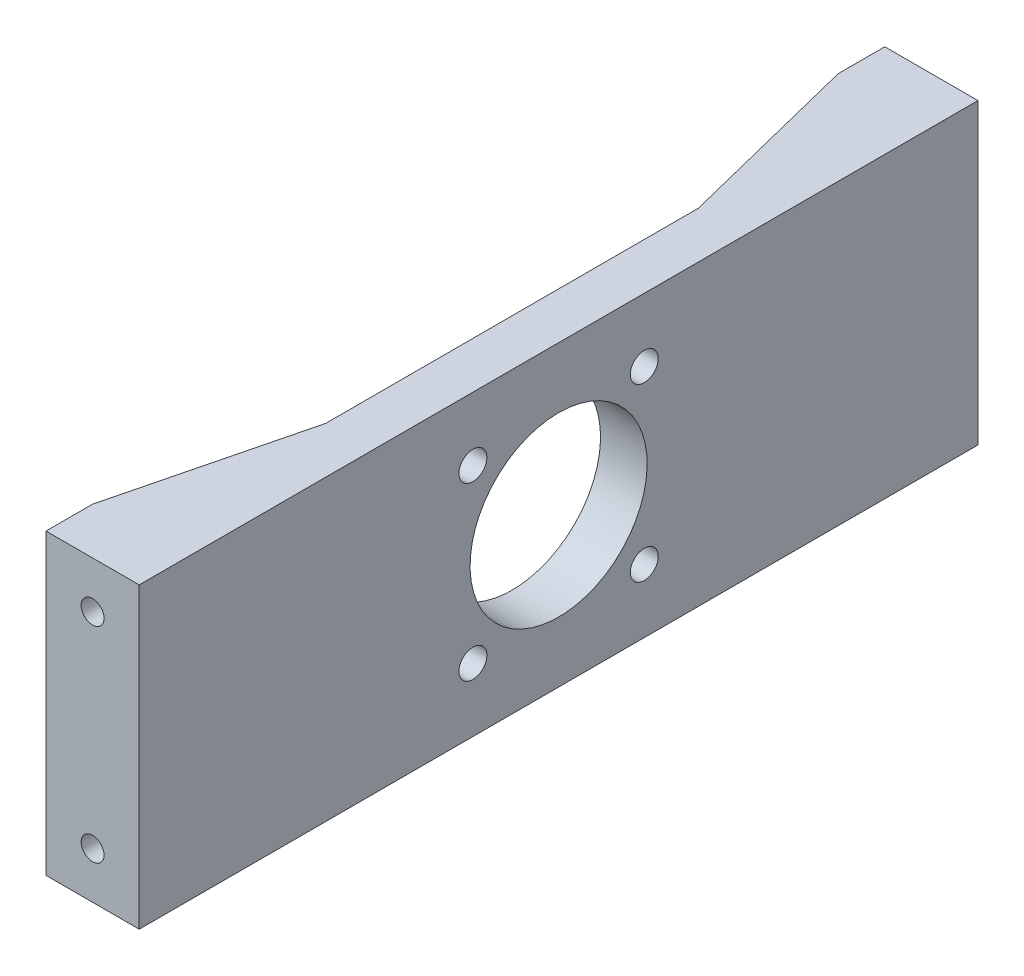
ISO-10303-21;
HEADER;
FILE_DESCRIPTION(('STEP AP214'),'2;1');
FILE_NAME('part.step','',(''),(''),'','','');
FILE_SCHEMA(('AUTOMOTIVE_DESIGN { 1 0 10303 214 1 1 1 1 }'));
ENDSEC;
DATA;
#1=APPLICATION_CONTEXT('core data for automotive mechanical design processes');
#2=APPLICATION_PROTOCOL_DEFINITION('international standard','automotive_design',2000,#1);
#3=PRODUCT_CONTEXT('',#1,'mechanical');
#4=PRODUCT('Part','Part','',(#3));
#5=PRODUCT_RELATED_PRODUCT_CATEGORY('part','',(#4));
#6=PRODUCT_DEFINITION_FORMATION('','',#4);
#7=PRODUCT_DEFINITION_CONTEXT('part definition',#1,'design');
#8=PRODUCT_DEFINITION('design','',#6,#7);
#9=PRODUCT_DEFINITION_SHAPE('','',#8);
#10=(LENGTH_UNIT() NAMED_UNIT(*) SI_UNIT(.MILLI.,.METRE.));
#11=(NAMED_UNIT(*) PLANE_ANGLE_UNIT() SI_UNIT($,.RADIAN.));
#12=(NAMED_UNIT(*) SI_UNIT($,.STERADIAN.) SOLID_ANGLE_UNIT());
#13=UNCERTAINTY_MEASURE_WITH_UNIT(LENGTH_MEASURE(1.E-05),#10,'distance_accuracy_value','');
#14=(GEOMETRIC_REPRESENTATION_CONTEXT(3) GLOBAL_UNCERTAINTY_ASSIGNED_CONTEXT((#13)) GLOBAL_UNIT_ASSIGNED_CONTEXT((#10,
#11,#12)) REPRESENTATION_CONTEXT('',''));
#15=CARTESIAN_POINT('',(0.,0.,0.));
#16=DIRECTION('',(0.,0.,1.));
#17=DIRECTION('',(1.,0.,0.));
#18=AXIS2_PLACEMENT_3D('',#15,#16,#17);
#19=CARTESIAN_POINT('',(5.00000000035369,26.9999999999929,82.0000000005621));
#20=DIRECTION('',(0.,0.,1.));
#21=DIRECTION('',(1.,0.,0.));
#22=AXIS2_PLACEMENT_3D('',#19,#20,#21);
#23=CONICAL_SURFACE('',#22,1.2294999993229,1.02974425725313);
#24=CARTESIAN_POINT('',(5.00000000022283,26.9999999999929,81.2612418678214));
#25=VERTEX_POINT('',#24);
#26=VERTEX_LOOP('',#25);
#27=FACE_BOUND('',#26,.T.);
#28=CARTESIAN_POINT('',(5.00000000035369,26.9999999999929,82.));
#29=DIRECTION('',(0.,0.,1.));
#30=DIRECTION('',(1.,0.,0.));
#31=AXIS2_PLACEMENT_3D('',#28,#29,#30);
#32=CIRCLE('',#31,1.2295);
#33=CARTESIAN_POINT('',(6.22950000035369,26.9999999999929,82.));
#34=VERTEX_POINT('',#33);
#35=EDGE_CURVE('E96',#34,#34,#32,.T.);
#36=ORIENTED_EDGE('',*,*,#35,.T.);
#37=EDGE_LOOP('',(#36));
#38=FACE_BOUND('',#37,.T.);
#39=ADVANCED_FACE('F17',(#27,#38),#23,.F.);
#40=CARTESIAN_POINT('',(5.00000000035364,4.99999999999286,82.0000000005621));
#41=DIRECTION('',(0.,0.,1.));
#42=DIRECTION('',(1.,0.,0.));
#43=AXIS2_PLACEMENT_3D('',#40,#41,#42);
#44=CONICAL_SURFACE('',#43,1.22949999932295,1.02974425725317);
#45=CARTESIAN_POINT('',(5.00000000022283,4.99999999999286,81.2612418678214));
#46=VERTEX_POINT('',#45);
#47=VERTEX_LOOP('',#46);
#48=FACE_BOUND('',#47,.T.);
#49=CARTESIAN_POINT('',(5.00000000035364,4.99999999999286,82.));
#50=DIRECTION('',(0.,0.,1.));
#51=DIRECTION('',(1.,0.,0.));
#52=AXIS2_PLACEMENT_3D('',#49,#50,#51);
#53=CIRCLE('',#52,1.2295);
#54=CARTESIAN_POINT('',(6.22950000035364,4.99999999999286,82.));
#55=VERTEX_POINT('',#54);
#56=EDGE_CURVE('E98',#55,#55,#53,.T.);
#57=ORIENTED_EDGE('',*,*,#56,.T.);
#58=EDGE_LOOP('',(#57));
#59=FACE_BOUND('',#58,.T.);
#60=ADVANCED_FACE('F93',(#48,#59),#44,.F.);
#61=CARTESIAN_POINT('',(5.00000000036735,27.0000000000009,7.99999999924239));
#62=DIRECTION('',(0.,0.,-1.));
#63=DIRECTION('',(-1.,0.,0.));
#64=AXIS2_PLACEMENT_3D('',#61,#62,#63);
#65=CONICAL_SURFACE('',#64,1.22949999959829,1.0297442575171);
#66=CARTESIAN_POINT('',(5.00000000027967,27.0000000000009,8.7387581319831));
#67=VERTEX_POINT('',#66);
#68=VERTEX_LOOP('',#67);
#69=FACE_BOUND('',#68,.T.);
#70=CARTESIAN_POINT('',(5.00000000036735,27.0000000000009,8.));
#71=DIRECTION('',(0.,0.,-1.));
#72=DIRECTION('',(-1.,0.,0.));
#73=AXIS2_PLACEMENT_3D('',#70,#71,#72);
#74=CIRCLE('',#73,1.2295);
#75=CARTESIAN_POINT('',(3.77050000036735,27.0000000000009,8.));
#76=VERTEX_POINT('',#75);
#77=EDGE_CURVE('E101',#76,#76,#74,.T.);
#78=ORIENTED_EDGE('',*,*,#77,.T.);
#79=EDGE_LOOP('',(#78));
#80=FACE_BOUND('',#79,.T.);
#81=ADVANCED_FACE('F178',(#69,#80),#65,.F.);
#82=CARTESIAN_POINT('',(5.0000000003673,5.00000000000096,7.99999999924239));
#83=DIRECTION('',(0.,0.,-1.));
#84=DIRECTION('',(-1.,0.,0.));
#85=AXIS2_PLACEMENT_3D('',#82,#83,#84);
#86=CONICAL_SURFACE('',#85,1.22949999959824,1.0297442575171);
#87=CARTESIAN_POINT('',(5.00000000027967,5.00000000000096,8.7387581319831));
#88=VERTEX_POINT('',#87);
#89=VERTEX_LOOP('',#88);
#90=FACE_BOUND('',#89,.T.);
#91=CARTESIAN_POINT('',(5.0000000003673,5.00000000000096,8.));
#92=DIRECTION('',(0.,0.,-1.));
#93=DIRECTION('',(-1.,0.,0.));
#94=AXIS2_PLACEMENT_3D('',#91,#92,#93);
#95=CIRCLE('',#94,1.2295);
#96=CARTESIAN_POINT('',(3.7705000003673,5.00000000000096,8.));
#97=VERTEX_POINT('',#96);
#98=EDGE_CURVE('E168',#97,#97,#95,.T.);
#99=ORIENTED_EDGE('',*,*,#98,.T.);
#100=EDGE_LOOP('',(#99));
#101=FACE_BOUND('',#100,.T.);
#102=ADVANCED_FACE('F359',(#90,#101),#86,.F.);
#103=CARTESIAN_POINT('',(5.00000000035369,26.9999999999929,86.));
#104=DIRECTION('',(0.,0.,1.));
#105=DIRECTION('',(1.,0.,0.));
#106=AXIS2_PLACEMENT_3D('',#103,#104,#105);
#107=CYLINDRICAL_SURFACE('',#106,1.2295);
#108=ORIENTED_EDGE('',*,*,#35,.F.);
#109=EDGE_LOOP('',(#108));
#110=FACE_BOUND('',#109,.T.);
#111=CARTESIAN_POINT('',(5.00000000035369,26.9999999999929,90.));
#112=DIRECTION('',(0.,0.,1.));
#113=DIRECTION('',(1.,0.,0.));
#114=AXIS2_PLACEMENT_3D('',#111,#112,#113);
#115=CIRCLE('',#114,1.2295);
#116=CARTESIAN_POINT('',(6.22950000035369,26.9999999999929,90.));
#117=VERTEX_POINT('',#116);
#118=EDGE_CURVE('E137',#117,#117,#115,.F.);
#119=ORIENTED_EDGE('',*,*,#118,.F.);
#120=EDGE_LOOP('',(#119));
#121=FACE_BOUND('',#120,.T.);
#122=ADVANCED_FACE('F355',(#110,#121),#107,.F.);
#123=CARTESIAN_POINT('',(5.00000000035364,4.99999999999286,86.));
#124=DIRECTION('',(0.,0.,1.));
#125=DIRECTION('',(1.,0.,0.));
#126=AXIS2_PLACEMENT_3D('',#123,#124,#125);
#127=CYLINDRICAL_SURFACE('',#126,1.2295);
#128=ORIENTED_EDGE('',*,*,#56,.F.);
#129=EDGE_LOOP('',(#128));
#130=FACE_BOUND('',#129,.T.);
#131=CARTESIAN_POINT('',(5.00000000035364,4.99999999999286,90.));
#132=DIRECTION('',(0.,0.,1.));
#133=DIRECTION('',(1.,0.,0.));
#134=AXIS2_PLACEMENT_3D('',#131,#132,#133);
#135=CIRCLE('',#134,1.2295);
#136=CARTESIAN_POINT('',(6.22950000035364,4.99999999999286,90.));
#137=VERTEX_POINT('',#136);
#138=EDGE_CURVE('E133',#137,#137,#135,.F.);
#139=ORIENTED_EDGE('',*,*,#138,.F.);
#140=EDGE_LOOP('',(#139));
#141=FACE_BOUND('',#140,.T.);
#142=ADVANCED_FACE('F184',(#130,#141),#127,.F.);
#143=CARTESIAN_POINT('',(5.00000000036735,27.0000000000009,4.));
#144=DIRECTION('',(0.,0.,-1.));
#145=DIRECTION('',(-1.,0.,0.));
#146=AXIS2_PLACEMENT_3D('',#143,#144,#145);
#147=CYLINDRICAL_SURFACE('',#146,1.2295);
#148=ORIENTED_EDGE('',*,*,#77,.F.);
#149=EDGE_LOOP('',(#148));
#150=FACE_BOUND('',#149,.T.);
#151=CARTESIAN_POINT('',(5.00000000036735,27.0000000000009,0.));
#152=DIRECTION('',(0.,0.,-1.));
#153=DIRECTION('',(-1.,0.,0.));
#154=AXIS2_PLACEMENT_3D('',#151,#152,#153);
#155=CIRCLE('',#154,1.2295);
#156=CARTESIAN_POINT('',(3.77050000036735,27.0000000000009,0.));
#157=VERTEX_POINT('',#156);
#158=EDGE_CURVE('E129',#157,#157,#155,.T.);
#159=ORIENTED_EDGE('',*,*,#158,.T.);
#160=EDGE_LOOP('',(#159));
#161=FACE_BOUND('',#160,.T.);
#162=ADVANCED_FACE('F180',(#150,#161),#147,.F.);
#163=CARTESIAN_POINT('',(5.0000000003673,5.00000000000096,4.));
#164=DIRECTION('',(0.,0.,-1.));
#165=DIRECTION('',(-1.,0.,0.));
#166=AXIS2_PLACEMENT_3D('',#163,#164,#165);
#167=CYLINDRICAL_SURFACE('',#166,1.2295);
#168=ORIENTED_EDGE('',*,*,#98,.F.);
#169=EDGE_LOOP('',(#168));
#170=FACE_BOUND('',#169,.T.);
#171=CARTESIAN_POINT('',(5.0000000003673,5.00000000000096,0.));
#172=DIRECTION('',(0.,0.,-1.));
#173=DIRECTION('',(-1.,0.,0.));
#174=AXIS2_PLACEMENT_3D('',#171,#172,#173);
#175=CIRCLE('',#174,1.2295);
#176=CARTESIAN_POINT('',(3.7705000003673,5.00000000000096,0.));
#177=VERTEX_POINT('',#176);
#178=EDGE_CURVE('E125',#177,#177,#175,.T.);
#179=ORIENTED_EDGE('',*,*,#178,.T.);
#180=EDGE_LOOP('',(#179));
#181=FACE_BOUND('',#180,.T.);
#182=ADVANCED_FACE('F183',(#170,#181),#167,.F.);
#183=CARTESIAN_POINT('',(0.,32.,85.));
#184=DIRECTION('',(0.970142500145332,0.,0.242535625036333));
#185=DIRECTION('',(0.242535625036333,0.,-0.970142500145332));
#186=AXIS2_PLACEMENT_3D('',#183,#184,#185);
#187=PLANE('',#186);
#188=DIRECTION('',(0.,1.,0.));
#189=VECTOR('',#188,1.);
#190=CARTESIAN_POINT('',(0.,0.,85.));
#191=LINE('',#190,#189);
#192=CARTESIAN_POINT('',(0.,32.,85.));
#193=VERTEX_POINT('',#192);
#194=CARTESIAN_POINT('',(0.,0.,85.));
#195=VERTEX_POINT('',#194);
#196=EDGE_CURVE('E165',#193,#195,#191,.F.);
#197=ORIENTED_EDGE('',*,*,#196,.F.);
#198=DIRECTION('',(-0.242535625036333,0.,0.970142500145332));
#199=VECTOR('',#198,1.);
#200=CARTESIAN_POINT('',(4.99999999999999,32.,65.));
#201=LINE('',#200,#199);
#202=CARTESIAN_POINT('',(4.99999999999999,32.,65.));
#203=VERTEX_POINT('',#202);
#204=EDGE_CURVE('E128',#203,#193,#201,.T.);
#205=ORIENTED_EDGE('',*,*,#204,.F.);
#206=DIRECTION('',(0.,1.,0.));
#207=VECTOR('',#206,1.);
#208=CARTESIAN_POINT('',(4.99999999999999,32.,65.));
#209=LINE('',#208,#207);
#210=CARTESIAN_POINT('',(4.99999999999999,0.,65.));
#211=VERTEX_POINT('',#210);
#212=EDGE_CURVE('E151',#203,#211,#209,.F.);
#213=ORIENTED_EDGE('',*,*,#212,.T.);
#214=DIRECTION('',(0.242535625036333,0.,-0.970142500145332));
#215=VECTOR('',#214,1.);
#216=CARTESIAN_POINT('',(0.,0.,85.));
#217=LINE('',#216,#215);
#218=EDGE_CURVE('E136',#195,#211,#217,.T.);
#219=ORIENTED_EDGE('',*,*,#218,.F.);
#220=EDGE_LOOP('',(#197,#205,#213,#219));
#221=FACE_BOUND('',#220,.T.);
#222=ADVANCED_FACE('F239',(#221),#187,.F.);
#223=CARTESIAN_POINT('',(0.,0.,0.));
#224=DIRECTION('',(-1.,0.,0.));
#225=DIRECTION('',(0.,0.,1.));
#226=AXIS2_PLACEMENT_3D('',#223,#224,#225);
#227=PLANE('',#226);
#228=DIRECTION('',(0.,1.,0.));
#229=VECTOR('',#228,1.);
#230=CARTESIAN_POINT('',(0.,16.,90.));
#231=LINE('',#230,#229);
#232=CARTESIAN_POINT('',(0.,32.,90.));
#233=VERTEX_POINT('',#232);
#234=CARTESIAN_POINT('',(0.,0.,90.));
#235=VERTEX_POINT('',#234);
#236=EDGE_CURVE('E140',#233,#235,#231,.F.);
#237=ORIENTED_EDGE('',*,*,#236,.F.);
#238=DIRECTION('',(0.,0.,1.));
#239=VECTOR('',#238,1.);
#240=CARTESIAN_POINT('',(0.,32.,0.));
#241=LINE('',#240,#239);
#242=EDGE_CURVE('E215',#193,#233,#241,.T.);
#243=ORIENTED_EDGE('',*,*,#242,.F.);
#244=ORIENTED_EDGE('',*,*,#196,.T.);
#245=DIRECTION('',(0.,0.,-1.));
#246=VECTOR('',#245,1.);
#247=CARTESIAN_POINT('',(0.,0.,0.));
#248=LINE('',#247,#246);
#249=EDGE_CURVE('E200',#235,#195,#248,.T.);
#250=ORIENTED_EDGE('',*,*,#249,.F.);
#251=EDGE_LOOP('',(#237,#243,#244,#250));
#252=FACE_BOUND('',#251,.T.);
#253=ADVANCED_FACE('F242',(#252),#227,.T.);
#254=CARTESIAN_POINT('',(0.,0.,0.));
#255=DIRECTION('',(-1.,0.,0.));
#256=DIRECTION('',(0.,0.,1.));
#257=AXIS2_PLACEMENT_3D('',#254,#255,#256);
#258=PLANE('',#257);
#259=DIRECTION('',(0.,1.,0.));
#260=VECTOR('',#259,1.);
#261=CARTESIAN_POINT('',(0.,16.,0.));
#262=LINE('',#261,#260);
#263=CARTESIAN_POINT('',(0.,32.,0.));
#264=VERTEX_POINT('',#263);
#265=CARTESIAN_POINT('',(0.,0.,0.));
#266=VERTEX_POINT('',#265);
#267=EDGE_CURVE('E195',#264,#266,#262,.F.);
#268=ORIENTED_EDGE('',*,*,#267,.T.);
#269=DIRECTION('',(0.,0.,-1.));
#270=VECTOR('',#269,1.);
#271=CARTESIAN_POINT('',(0.,0.,0.));
#272=LINE('',#271,#270);
#273=CARTESIAN_POINT('',(0.,0.,5.00000000000005));
#274=VERTEX_POINT('',#273);
#275=EDGE_CURVE('E229',#274,#266,#272,.T.);
#276=ORIENTED_EDGE('',*,*,#275,.F.);
#277=DIRECTION('',(0.,1.,0.));
#278=VECTOR('',#277,1.);
#279=CARTESIAN_POINT('',(0.,32.,5.00000000000004));
#280=LINE('',#279,#278);
#281=CARTESIAN_POINT('',(0.,32.,5.00000000000004));
#282=VERTEX_POINT('',#281);
#283=EDGE_CURVE('E159',#274,#282,#280,.T.);
#284=ORIENTED_EDGE('',*,*,#283,.T.);
#285=DIRECTION('',(0.,0.,1.));
#286=VECTOR('',#285,1.);
#287=CARTESIAN_POINT('',(0.,32.,0.));
#288=LINE('',#287,#286);
#289=EDGE_CURVE('E203',#264,#282,#288,.T.);
#290=ORIENTED_EDGE('',*,*,#289,.F.);
#291=EDGE_LOOP('',(#268,#276,#284,#290));
#292=FACE_BOUND('',#291,.T.);
#293=ADVANCED_FACE('F204',(#292),#258,.T.);
#294=CARTESIAN_POINT('',(4.99999999999999,32.,25.));
#295=DIRECTION('',(0.970142500145332,0.,-0.242535625036333));
#296=DIRECTION('',(-0.242535625036333,0.,-0.970142500145332));
#297=AXIS2_PLACEMENT_3D('',#294,#295,#296);
#298=PLANE('',#297);
#299=DIRECTION('',(0.,1.,0.));
#300=VECTOR('',#299,1.);
#301=CARTESIAN_POINT('',(4.99999999999999,32.,25.));
#302=LINE('',#301,#300);
#303=CARTESIAN_POINT('',(4.99999999999999,0.,25.));
#304=VERTEX_POINT('',#303);
#305=CARTESIAN_POINT('',(4.99999999999999,32.,25.));
#306=VERTEX_POINT('',#305);
#307=EDGE_CURVE('E154',#304,#306,#302,.T.);
#308=ORIENTED_EDGE('',*,*,#307,.T.);
#309=DIRECTION('',(0.242535625036333,0.,0.970142500145332));
#310=VECTOR('',#309,1.);
#311=CARTESIAN_POINT('',(0.,32.,5.));
#312=LINE('',#311,#310);
#313=EDGE_CURVE('E208',#282,#306,#312,.T.);
#314=ORIENTED_EDGE('',*,*,#313,.F.);
#315=ORIENTED_EDGE('',*,*,#283,.F.);
#316=DIRECTION('',(-0.242535625036333,0.,-0.970142500145332));
#317=VECTOR('',#316,1.);
#318=CARTESIAN_POINT('',(4.99999999999999,0.,25.));
#319=LINE('',#318,#317);
#320=EDGE_CURVE('E231',#304,#274,#319,.T.);
#321=ORIENTED_EDGE('',*,*,#320,.F.);
#322=EDGE_LOOP('',(#308,#314,#315,#321));
#323=FACE_BOUND('',#322,.T.);
#324=ADVANCED_FACE('F251',(#323),#298,.F.);
#325=CARTESIAN_POINT('',(4.99999999919964,25.1923881554251,54.1923881554251));
#326=DIRECTION('',(-1.,0.,0.));
#327=DIRECTION('',(0.,0.,1.));
#328=AXIS2_PLACEMENT_3D('',#325,#326,#327);
#329=CONICAL_SURFACE('',#328,3.24999999921573,0.785398162504195);
#330=CARTESIAN_POINT('',(6.74999999999999,25.1923881554251,54.1923881554251));
#331=DIRECTION('',(-1.,0.,0.));
#332=DIRECTION('',(0.,0.,1.));
#333=AXIS2_PLACEMENT_3D('',#330,#331,#332);
#334=CIRCLE('',#333,1.5);
#335=CARTESIAN_POINT('',(6.74999999999999,25.1923881554251,55.6923881554251));
#336=VERTEX_POINT('',#335);
#337=EDGE_CURVE('E276',#336,#336,#334,.F.);
#338=ORIENTED_EDGE('',*,*,#337,.T.);
#339=EDGE_LOOP('',(#338));
#340=FACE_BOUND('',#339,.T.);
#341=CARTESIAN_POINT('',(4.99999999919964,25.1923881554251,54.1923881554251));
#342=DIRECTION('',(-1.,0.,0.));
#343=DIRECTION('',(0.,0.,1.));
#344=AXIS2_PLACEMENT_3D('',#341,#342,#343);
#345=CIRCLE('',#344,3.24999999921573);
#346=CARTESIAN_POINT('',(4.99999999919964,25.1923881554251,57.4423881546409));
#347=VERTEX_POINT('',#346);
#348=EDGE_CURVE('E20',#347,#347,#345,.T.);
#349=ORIENTED_EDGE('',*,*,#348,.T.);
#350=EDGE_LOOP('',(#349));
#351=FACE_BOUND('',#350,.T.);
#352=ADVANCED_FACE('F285',(#340,#351),#329,.F.);
#353=CARTESIAN_POINT('',(4.99999999919964,6.80761184457488,54.1923881554251));
#354=DIRECTION('',(-1.,0.,0.));
#355=DIRECTION('',(0.,0.,1.));
#356=AXIS2_PLACEMENT_3D('',#353,#354,#355);
#357=CONICAL_SURFACE('',#356,3.24999999921574,0.785398162504195);
#358=CARTESIAN_POINT('',(6.74999999999999,6.80761184457488,54.1923881554251));
#359=DIRECTION('',(-1.,0.,0.));
#360=DIRECTION('',(0.,0.,1.));
#361=AXIS2_PLACEMENT_3D('',#358,#359,#360);
#362=CIRCLE('',#361,1.5);
#363=CARTESIAN_POINT('',(6.74999999999999,6.80761184457488,55.6923881554251));
#364=VERTEX_POINT('',#363);
#365=EDGE_CURVE('E271',#364,#364,#362,.F.);
#366=ORIENTED_EDGE('',*,*,#365,.T.);
#367=EDGE_LOOP('',(#366));
#368=FACE_BOUND('',#367,.T.);
#369=CARTESIAN_POINT('',(4.99999999919964,6.80761184457488,54.1923881554251));
#370=DIRECTION('',(-1.,0.,0.));
#371=DIRECTION('',(0.,0.,1.));
#372=AXIS2_PLACEMENT_3D('',#369,#370,#371);
#373=CIRCLE('',#372,3.24999999921574);
#374=CARTESIAN_POINT('',(4.99999999919964,6.80761184457488,57.4423881546409));
#375=VERTEX_POINT('',#374);
#376=EDGE_CURVE('E146',#375,#375,#373,.T.);
#377=ORIENTED_EDGE('',*,*,#376,.T.);
#378=EDGE_LOOP('',(#377));
#379=FACE_BOUND('',#378,.T.);
#380=ADVANCED_FACE('F335',(#368,#379),#357,.F.);
#381=CARTESIAN_POINT('',(4.99999999925649,6.80761184457489,35.8076118445749));
#382=DIRECTION('',(-1.,0.,0.));
#383=DIRECTION('',(0.,0.,1.));
#384=AXIS2_PLACEMENT_3D('',#381,#382,#383);
#385=CONICAL_SURFACE('',#384,3.24999999907077,0.785398162487954);
#386=CARTESIAN_POINT('',(6.74999999999999,6.80761184457489,35.8076118445749));
#387=DIRECTION('',(-1.,0.,0.));
#388=DIRECTION('',(0.,0.,1.));
#389=AXIS2_PLACEMENT_3D('',#386,#387,#388);
#390=CIRCLE('',#389,1.5);
#391=CARTESIAN_POINT('',(6.74999999999999,6.80761184457489,37.3076118445749));
#392=VERTEX_POINT('',#391);
#393=EDGE_CURVE('E266',#392,#392,#390,.F.);
#394=ORIENTED_EDGE('',*,*,#393,.T.);
#395=EDGE_LOOP('',(#394));
#396=FACE_BOUND('',#395,.T.);
#397=CARTESIAN_POINT('',(4.99999999919964,6.80761184457489,35.8076118445749));
#398=DIRECTION('',(-1.,0.,0.));
#399=DIRECTION('',(0.,0.,1.));
#400=AXIS2_PLACEMENT_3D('',#397,#398,#399);
#401=CIRCLE('',#400,3.24999999912761);
#402=CARTESIAN_POINT('',(4.99999999919964,6.80761184457489,39.0576118437025));
#403=VERTEX_POINT('',#402);
#404=EDGE_CURVE('E144',#403,#403,#401,.T.);
#405=ORIENTED_EDGE('',*,*,#404,.T.);
#406=EDGE_LOOP('',(#405));
#407=FACE_BOUND('',#406,.T.);
#408=ADVANCED_FACE('F331',(#396,#407),#385,.F.);
#409=CARTESIAN_POINT('',(4.99999999925649,25.1923881554251,35.8076118445749));
#410=DIRECTION('',(-1.,0.,0.));
#411=DIRECTION('',(0.,0.,1.));
#412=AXIS2_PLACEMENT_3D('',#409,#410,#411);
#413=CONICAL_SURFACE('',#412,3.24999999907077,0.785398162487954);
#414=CARTESIAN_POINT('',(6.74999999999999,25.1923881554251,35.8076118445749));
#415=DIRECTION('',(-1.,0.,0.));
#416=DIRECTION('',(0.,0.,1.));
#417=AXIS2_PLACEMENT_3D('',#414,#415,#416);
#418=CIRCLE('',#417,1.5);
#419=CARTESIAN_POINT('',(6.74999999999999,25.1923881554251,37.3076118445749));
#420=VERTEX_POINT('',#419);
#421=EDGE_CURVE('E124',#420,#420,#418,.F.);
#422=ORIENTED_EDGE('',*,*,#421,.T.);
#423=EDGE_LOOP('',(#422));
#424=FACE_BOUND('',#423,.T.);
#425=CARTESIAN_POINT('',(4.99999999919964,25.1923881554251,35.8076118445749));
#426=DIRECTION('',(-1.,0.,0.));
#427=DIRECTION('',(0.,0.,1.));
#428=AXIS2_PLACEMENT_3D('',#425,#426,#427);
#429=CIRCLE('',#428,3.24999999912761);
#430=CARTESIAN_POINT('',(4.99999999919964,25.1923881554251,39.0576118437025));
#431=VERTEX_POINT('',#430);
#432=EDGE_CURVE('E141',#431,#431,#429,.T.);
#433=ORIENTED_EDGE('',*,*,#432,.T.);
#434=EDGE_LOOP('',(#433));
#435=FACE_BOUND('',#434,.T.);
#436=ADVANCED_FACE('F327',(#424,#435),#413,.F.);
#437=CARTESIAN_POINT('',(4.99999999999999,32.,65.));
#438=DIRECTION('',(1.,0.,0.));
#439=DIRECTION('',(0.,0.,-1.));
#440=AXIS2_PLACEMENT_3D('',#437,#438,#439);
#441=PLANE('',#440);
#442=CARTESIAN_POINT('',(5.,16.,45.));
#443=DIRECTION('',(1.,0.,0.));
#444=DIRECTION('',(0.,1.,0.));
#445=AXIS2_PLACEMENT_3D('',#442,#443,#444);
#446=CIRCLE('',#445,9.5);
#447=CARTESIAN_POINT('',(5.,25.5,45.));
#448=VERTEX_POINT('',#447);
#449=EDGE_CURVE('E120',#448,#448,#446,.T.);
#450=ORIENTED_EDGE('',*,*,#449,.T.);
#451=EDGE_LOOP('',(#450));
#452=FACE_BOUND('',#451,.T.);
#453=ORIENTED_EDGE('',*,*,#432,.F.);
#454=EDGE_LOOP('',(#453));
#455=FACE_BOUND('',#454,.T.);
#456=ORIENTED_EDGE('',*,*,#404,.F.);
#457=EDGE_LOOP('',(#456));
#458=FACE_BOUND('',#457,.T.);
#459=ORIENTED_EDGE('',*,*,#376,.F.);
#460=EDGE_LOOP('',(#459));
#461=FACE_BOUND('',#460,.T.);
#462=ORIENTED_EDGE('',*,*,#348,.F.);
#463=EDGE_LOOP('',(#462));
#464=FACE_BOUND('',#463,.T.);
#465=ORIENTED_EDGE('',*,*,#212,.F.);
#466=DIRECTION('',(0.,0.,1.));
#467=VECTOR('',#466,1.);
#468=CARTESIAN_POINT('',(4.99999999999999,32.,0.));
#469=LINE('',#468,#467);
#470=EDGE_CURVE('E246',#306,#203,#469,.T.);
#471=ORIENTED_EDGE('',*,*,#470,.F.);
#472=ORIENTED_EDGE('',*,*,#307,.F.);
#473=DIRECTION('',(0.,0.,-1.));
#474=VECTOR('',#473,1.);
#475=CARTESIAN_POINT('',(4.99999999999999,0.,0.));
#476=LINE('',#475,#474);
#477=EDGE_CURVE('E234',#211,#304,#476,.T.);
#478=ORIENTED_EDGE('',*,*,#477,.F.);
#479=EDGE_LOOP('',(#465,#471,#472,#478));
#480=FACE_BOUND('',#479,.T.);
#481=ADVANCED_FACE('F248',(#452,#455,#458,#461,#464,#480),#441,.F.);
#482=CARTESIAN_POINT('',(5.,16.,90.));
#483=DIRECTION('',(0.,0.,1.));
#484=DIRECTION('',(1.,0.,0.));
#485=AXIS2_PLACEMENT_3D('',#482,#483,#484);
#486=PLANE('',#485);
#487=ORIENTED_EDGE('',*,*,#138,.T.);
#488=EDGE_LOOP('',(#487));
#489=FACE_BOUND('',#488,.T.);
#490=ORIENTED_EDGE('',*,*,#118,.T.);
#491=EDGE_LOOP('',(#490));
#492=FACE_BOUND('',#491,.T.);
#493=DIRECTION('',(0.,1.,0.));
#494=VECTOR('',#493,1.);
#495=CARTESIAN_POINT('',(9.99999999999999,32.,90.));
#496=LINE('',#495,#494);
#497=CARTESIAN_POINT('',(10.,32.,90.));
#498=VERTEX_POINT('',#497);
#499=CARTESIAN_POINT('',(10.,0.,90.));
#500=VERTEX_POINT('',#499);
#501=EDGE_CURVE('E123',#498,#500,#496,.F.);
#502=ORIENTED_EDGE('',*,*,#501,.F.);
#503=DIRECTION('',(1.,0.,0.));
#504=VECTOR('',#503,1.);
#505=CARTESIAN_POINT('',(0.,32.,90.));
#506=LINE('',#505,#504);
#507=EDGE_CURVE('E213',#233,#498,#506,.T.);
#508=ORIENTED_EDGE('',*,*,#507,.F.);
#509=ORIENTED_EDGE('',*,*,#236,.T.);
#510=DIRECTION('',(1.,0.,0.));
#511=VECTOR('',#510,1.);
#512=CARTESIAN_POINT('',(10.,0.,90.));
#513=LINE('',#512,#511);
#514=EDGE_CURVE('E226',#500,#235,#513,.F.);
#515=ORIENTED_EDGE('',*,*,#514,.F.);
#516=EDGE_LOOP('',(#502,#508,#509,#515));
#517=FACE_BOUND('',#516,.T.);
#518=ADVANCED_FACE('F321',(#489,#492,#517),#486,.T.);
#519=CARTESIAN_POINT('',(10.,0.,0.));
#520=DIRECTION('',(0.,-1.,0.));
#521=DIRECTION('',(0.,0.,-1.));
#522=AXIS2_PLACEMENT_3D('',#519,#520,#521);
#523=PLANE('',#522);
#524=ORIENTED_EDGE('',*,*,#514,.T.);
#525=ORIENTED_EDGE('',*,*,#249,.T.);
#526=ORIENTED_EDGE('',*,*,#218,.T.);
#527=ORIENTED_EDGE('',*,*,#477,.T.);
#528=ORIENTED_EDGE('',*,*,#320,.T.);
#529=ORIENTED_EDGE('',*,*,#275,.T.);
#530=DIRECTION('',(1.,0.,0.));
#531=VECTOR('',#530,1.);
#532=CARTESIAN_POINT('',(5.,0.,0.));
#533=LINE('',#532,#531);
#534=CARTESIAN_POINT('',(10.,0.,0.));
#535=VERTEX_POINT('',#534);
#536=EDGE_CURVE('E132',#266,#535,#533,.T.);
#537=ORIENTED_EDGE('',*,*,#536,.T.);
#538=DIRECTION('',(0.,0.,-1.));
#539=VECTOR('',#538,1.);
#540=CARTESIAN_POINT('',(9.99999999999999,0.,0.));
#541=LINE('',#540,#539);
#542=EDGE_CURVE('E254',#500,#535,#541,.T.);
#543=ORIENTED_EDGE('',*,*,#542,.F.);
#544=EDGE_LOOP('',(#524,#525,#526,#527,#528,#529,#537,#543));
#545=FACE_BOUND('',#544,.T.);
#546=ADVANCED_FACE('F191',(#545),#523,.T.);
#547=CARTESIAN_POINT('',(5.,16.,0.));
#548=DIRECTION('',(0.,0.,1.));
#549=DIRECTION('',(1.,0.,0.));
#550=AXIS2_PLACEMENT_3D('',#547,#548,#549);
#551=PLANE('',#550);
#552=ORIENTED_EDGE('',*,*,#178,.F.);
#553=EDGE_LOOP('',(#552));
#554=FACE_BOUND('',#553,.T.);
#555=ORIENTED_EDGE('',*,*,#158,.F.);
#556=EDGE_LOOP('',(#555));
#557=FACE_BOUND('',#556,.T.);
#558=ORIENTED_EDGE('',*,*,#267,.F.);
#559=DIRECTION('',(1.,0.,0.));
#560=VECTOR('',#559,1.);
#561=CARTESIAN_POINT('',(0.,32.,0.));
#562=LINE('',#561,#560);
#563=CARTESIAN_POINT('',(10.,32.,0.));
#564=VERTEX_POINT('',#563);
#565=EDGE_CURVE('E35',#564,#264,#562,.F.);
#566=ORIENTED_EDGE('',*,*,#565,.F.);
#567=DIRECTION('',(0.,1.,0.));
#568=VECTOR('',#567,1.);
#569=CARTESIAN_POINT('',(9.99999999999999,32.,0.));
#570=LINE('',#569,#568);
#571=EDGE_CURVE('E256',#535,#564,#570,.T.);
#572=ORIENTED_EDGE('',*,*,#571,.F.);
#573=ORIENTED_EDGE('',*,*,#536,.F.);
#574=EDGE_LOOP('',(#558,#566,#572,#573));
#575=FACE_BOUND('',#574,.T.);
#576=ADVANCED_FACE('F188',(#554,#557,#575),#551,.F.);
#577=CARTESIAN_POINT('',(0.,32.,0.));
#578=DIRECTION('',(0.,1.,0.));
#579=DIRECTION('',(0.,0.,1.));
#580=AXIS2_PLACEMENT_3D('',#577,#578,#579);
#581=PLANE('',#580);
#582=ORIENTED_EDGE('',*,*,#313,.T.);
#583=ORIENTED_EDGE('',*,*,#470,.T.);
#584=ORIENTED_EDGE('',*,*,#204,.T.);
#585=ORIENTED_EDGE('',*,*,#242,.T.);
#586=ORIENTED_EDGE('',*,*,#507,.T.);
#587=DIRECTION('',(0.,0.,-1.));
#588=VECTOR('',#587,1.);
#589=CARTESIAN_POINT('',(9.99999999999999,32.,0.));
#590=LINE('',#589,#588);
#591=EDGE_CURVE('E119',#564,#498,#590,.F.);
#592=ORIENTED_EDGE('',*,*,#591,.F.);
#593=ORIENTED_EDGE('',*,*,#565,.T.);
#594=ORIENTED_EDGE('',*,*,#289,.T.);
#595=EDGE_LOOP('',(#582,#583,#584,#585,#586,#592,#593,#594));
#596=FACE_BOUND('',#595,.T.);
#597=ADVANCED_FACE('F190',(#596),#581,.T.);
#598=CARTESIAN_POINT('',(101.041657628344,25.1923881554251,54.1923881554251));
#599=DIRECTION('',(-1.,0.,0.));
#600=DIRECTION('',(0.,0.,1.));
#601=AXIS2_PLACEMENT_3D('',#598,#599,#600);
#602=CYLINDRICAL_SURFACE('',#601,1.5);
#603=ORIENTED_EDGE('',*,*,#337,.F.);
#604=EDGE_LOOP('',(#603));
#605=FACE_BOUND('',#604,.T.);
#606=CARTESIAN_POINT('',(9.99999999999999,25.1923881554251,54.1923881554251));
#607=DIRECTION('',(-1.,0.,0.));
#608=DIRECTION('',(0.,0.,1.));
#609=AXIS2_PLACEMENT_3D('',#606,#607,#608);
#610=CIRCLE('',#609,1.5);
#611=CARTESIAN_POINT('',(9.99999999999999,25.1923881554251,55.6923881554251));
#612=VERTEX_POINT('',#611);
#613=EDGE_CURVE('E116',#612,#612,#610,.T.);
#614=ORIENTED_EDGE('',*,*,#613,.F.);
#615=EDGE_LOOP('',(#614));
#616=FACE_BOUND('',#615,.T.);
#617=ADVANCED_FACE('F287',(#605,#616),#602,.F.);
#618=CARTESIAN_POINT('',(101.041657628344,6.80761184457488,54.1923881554251));
#619=DIRECTION('',(-1.,0.,0.));
#620=DIRECTION('',(0.,0.,1.));
#621=AXIS2_PLACEMENT_3D('',#618,#619,#620);
#622=CYLINDRICAL_SURFACE('',#621,1.5);
#623=ORIENTED_EDGE('',*,*,#365,.F.);
#624=EDGE_LOOP('',(#623));
#625=FACE_BOUND('',#624,.T.);
#626=CARTESIAN_POINT('',(9.99999999999999,6.80761184457488,54.1923881554251));
#627=DIRECTION('',(-1.,0.,0.));
#628=DIRECTION('',(0.,0.,1.));
#629=AXIS2_PLACEMENT_3D('',#626,#627,#628);
#630=CIRCLE('',#629,1.5);
#631=CARTESIAN_POINT('',(9.99999999999999,6.80761184457488,55.6923881554251));
#632=VERTEX_POINT('',#631);
#633=EDGE_CURVE('E113',#632,#632,#630,.T.);
#634=ORIENTED_EDGE('',*,*,#633,.F.);
#635=EDGE_LOOP('',(#634));
#636=FACE_BOUND('',#635,.T.);
#637=ADVANCED_FACE('F290',(#625,#636),#622,.F.);
#638=CARTESIAN_POINT('',(101.041657628344,6.80761184457489,35.8076118445749));
#639=DIRECTION('',(-1.,0.,0.));
#640=DIRECTION('',(0.,0.,1.));
#641=AXIS2_PLACEMENT_3D('',#638,#639,#640);
#642=CYLINDRICAL_SURFACE('',#641,1.5);
#643=ORIENTED_EDGE('',*,*,#393,.F.);
#644=EDGE_LOOP('',(#643));
#645=FACE_BOUND('',#644,.T.);
#646=CARTESIAN_POINT('',(9.99999999999999,6.80761184457489,35.8076118445749));
#647=DIRECTION('',(-1.,0.,0.));
#648=DIRECTION('',(0.,0.,1.));
#649=AXIS2_PLACEMENT_3D('',#646,#647,#648);
#650=CIRCLE('',#649,1.5);
#651=CARTESIAN_POINT('',(9.99999999999999,6.80761184457489,37.3076118445749));
#652=VERTEX_POINT('',#651);
#653=EDGE_CURVE('E110',#652,#652,#650,.T.);
#654=ORIENTED_EDGE('',*,*,#653,.F.);
#655=EDGE_LOOP('',(#654));
#656=FACE_BOUND('',#655,.T.);
#657=ADVANCED_FACE('F309',(#645,#656),#642,.F.);
#658=CARTESIAN_POINT('',(101.041657628344,25.1923881554251,35.8076118445749));
#659=DIRECTION('',(-1.,0.,0.));
#660=DIRECTION('',(0.,0.,1.));
#661=AXIS2_PLACEMENT_3D('',#658,#659,#660);
#662=CYLINDRICAL_SURFACE('',#661,1.5);
#663=ORIENTED_EDGE('',*,*,#421,.F.);
#664=EDGE_LOOP('',(#663));
#665=FACE_BOUND('',#664,.T.);
#666=CARTESIAN_POINT('',(9.99999999999999,25.1923881554251,35.8076118445749));
#667=DIRECTION('',(-1.,0.,0.));
#668=DIRECTION('',(0.,0.,1.));
#669=AXIS2_PLACEMENT_3D('',#666,#667,#668);
#670=CIRCLE('',#669,1.5);
#671=CARTESIAN_POINT('',(9.99999999999999,25.1923881554251,37.3076118445749));
#672=VERTEX_POINT('',#671);
#673=EDGE_CURVE('E26',#672,#672,#670,.T.);
#674=ORIENTED_EDGE('',*,*,#673,.F.);
#675=EDGE_LOOP('',(#674));
#676=FACE_BOUND('',#675,.T.);
#677=ADVANCED_FACE('F302',(#665,#676),#662,.F.);
#678=CARTESIAN_POINT('',(0.,16.,45.));
#679=DIRECTION('',(1.,0.,0.));
#680=DIRECTION('',(0.,1.,0.));
#681=AXIS2_PLACEMENT_3D('',#678,#679,#680);
#682=CYLINDRICAL_SURFACE('',#681,9.5);
#683=CARTESIAN_POINT('',(10.,16.,45.));
#684=DIRECTION('',(1.,0.,0.));
#685=DIRECTION('',(0.,1.,0.));
#686=AXIS2_PLACEMENT_3D('',#683,#684,#685);
#687=CIRCLE('',#686,9.5);
#688=CARTESIAN_POINT('',(10.,25.5,45.));
#689=VERTEX_POINT('',#688);
#690=EDGE_CURVE('E11',#689,#689,#687,.F.);
#691=ORIENTED_EDGE('',*,*,#690,.F.);
#692=EDGE_LOOP('',(#691));
#693=FACE_BOUND('',#692,.T.);
#694=ORIENTED_EDGE('',*,*,#449,.F.);
#695=EDGE_LOOP('',(#694));
#696=FACE_BOUND('',#695,.T.);
#697=ADVANCED_FACE('F295',(#693,#696),#682,.F.);
#698=CARTESIAN_POINT('',(9.99999999999999,32.,0.));
#699=DIRECTION('',(1.,0.,0.));
#700=DIRECTION('',(0.,0.,-1.));
#701=AXIS2_PLACEMENT_3D('',#698,#699,#700);
#702=PLANE('',#701);
#703=ORIENTED_EDGE('',*,*,#690,.T.);
#704=EDGE_LOOP('',(#703));
#705=FACE_BOUND('',#704,.T.);
#706=ORIENTED_EDGE('',*,*,#673,.T.);
#707=EDGE_LOOP('',(#706));
#708=FACE_BOUND('',#707,.T.);
#709=ORIENTED_EDGE('',*,*,#653,.T.);
#710=EDGE_LOOP('',(#709));
#711=FACE_BOUND('',#710,.T.);
#712=ORIENTED_EDGE('',*,*,#633,.T.);
#713=EDGE_LOOP('',(#712));
#714=FACE_BOUND('',#713,.T.);
#715=ORIENTED_EDGE('',*,*,#613,.T.);
#716=EDGE_LOOP('',(#715));
#717=FACE_BOUND('',#716,.T.);
#718=ORIENTED_EDGE('',*,*,#571,.T.);
#719=ORIENTED_EDGE('',*,*,#591,.T.);
#720=ORIENTED_EDGE('',*,*,#501,.T.);
#721=ORIENTED_EDGE('',*,*,#542,.T.);
#722=EDGE_LOOP('',(#718,#719,#720,#721));
#723=FACE_BOUND('',#722,.T.);
#724=ADVANCED_FACE('F259',(#705,#708,#711,#714,#717,#723),#702,.T.);
#725=CLOSED_SHELL('',(#39,#60,#81,#102,#122,#142,#162,#182,#222,#253,#293,#324,#352,#380,#408,
#436,#481,#518,#546,#576,#597,#617,#637,#657,#677,#697,#724));
#726=MANIFOLD_SOLID_BREP('B1',#725);
#727=ADVANCED_BREP_SHAPE_REPRESENTATION('',(#18,#726),#14);
#728=SHAPE_DEFINITION_REPRESENTATION(#9,#727);
ENDSEC;
END-ISO-10303-21;
